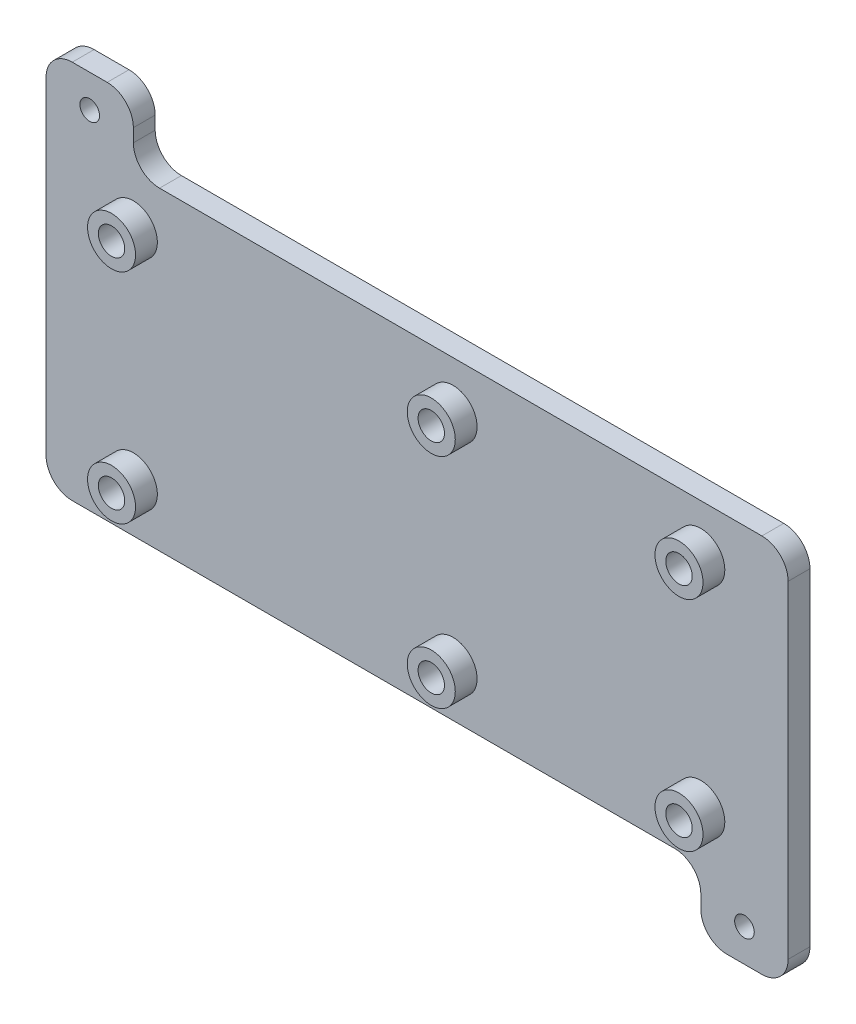
ISO-10303-21;
HEADER;
FILE_DESCRIPTION(('STEP AP214'),'2;1');
FILE_NAME('part.step','',(''),(''),'','','');
FILE_SCHEMA(('AUTOMOTIVE_DESIGN { 1 0 10303 214 1 1 1 1 }'));
ENDSEC;
DATA;
#1=APPLICATION_CONTEXT('core data for automotive mechanical design processes');
#2=APPLICATION_PROTOCOL_DEFINITION('international standard','automotive_design',2000,#1);
#3=PRODUCT_CONTEXT('',#1,'mechanical');
#4=PRODUCT('Part','Part','',(#3));
#5=PRODUCT_RELATED_PRODUCT_CATEGORY('part','',(#4));
#6=PRODUCT_DEFINITION_FORMATION('','',#4);
#7=PRODUCT_DEFINITION_CONTEXT('part definition',#1,'design');
#8=PRODUCT_DEFINITION('design','',#6,#7);
#9=PRODUCT_DEFINITION_SHAPE('','',#8);
#10=(LENGTH_UNIT() NAMED_UNIT(*) SI_UNIT(.MILLI.,.METRE.));
#11=(NAMED_UNIT(*) PLANE_ANGLE_UNIT() SI_UNIT($,.RADIAN.));
#12=(NAMED_UNIT(*) SI_UNIT($,.STERADIAN.) SOLID_ANGLE_UNIT());
#13=UNCERTAINTY_MEASURE_WITH_UNIT(LENGTH_MEASURE(1.E-05),#10,'distance_accuracy_value','');
#14=(GEOMETRIC_REPRESENTATION_CONTEXT(3) GLOBAL_UNCERTAINTY_ASSIGNED_CONTEXT((#13)) GLOBAL_UNIT_ASSIGNED_CONTEXT((#10,
#11,#12)) REPRESENTATION_CONTEXT('',''));
#15=CARTESIAN_POINT('',(0.,0.,0.));
#16=DIRECTION('',(0.,0.,1.));
#17=DIRECTION('',(1.,0.,0.));
#18=AXIS2_PLACEMENT_3D('',#15,#16,#17);
#19=CARTESIAN_POINT('',(85.,36.,5.));
#20=DIRECTION('',(-1.,0.,0.));
#21=DIRECTION('',(0.,-1.,0.));
#22=AXIS2_PLACEMENT_3D('',#19,#20,#21);
#23=PLANE('',#22);
#24=DIRECTION('',(0.,1.,0.));
#25=VECTOR('',#24,1.);
#26=CARTESIAN_POINT('',(85.,36.,5.));
#27=LINE('',#26,#25);
#28=CARTESIAN_POINT('',(85.,-45.,5.));
#29=VERTEX_POINT('',#28);
#30=CARTESIAN_POINT('',(85.,30.,5.));
#31=VERTEX_POINT('',#30);
#32=EDGE_CURVE('E191',#29,#31,#27,.T.);
#33=ORIENTED_EDGE('',*,*,#32,.F.);
#34=DIRECTION('',(0.,0.,1.));
#35=VECTOR('',#34,1.);
#36=CARTESIAN_POINT('',(85.,-45.,5.));
#37=LINE('',#36,#35);
#38=CARTESIAN_POINT('',(85.,-45.,0.));
#39=VERTEX_POINT('',#38);
#40=EDGE_CURVE('E275',#29,#39,#37,.F.);
#41=ORIENTED_EDGE('',*,*,#40,.T.);
#42=DIRECTION('',(0.,1.,0.));
#43=VECTOR('',#42,1.);
#44=CARTESIAN_POINT('',(85.,36.,0.));
#45=LINE('',#44,#43);
#46=CARTESIAN_POINT('',(85.,30.,0.));
#47=VERTEX_POINT('',#46);
#48=EDGE_CURVE('E332',#39,#47,#45,.T.);
#49=ORIENTED_EDGE('',*,*,#48,.T.);
#50=DIRECTION('',(0.,0.,-1.));
#51=VECTOR('',#50,1.);
#52=CARTESIAN_POINT('',(85.,30.,5.));
#53=LINE('',#52,#51);
#54=EDGE_CURVE('E272',#47,#31,#53,.F.);
#55=ORIENTED_EDGE('',*,*,#54,.T.);
#56=EDGE_LOOP('',(#33,#41,#49,#55));
#57=FACE_BOUND('',#56,.T.);
#58=ADVANCED_FACE('F45',(#57),#23,.F.);
#59=CARTESIAN_POINT('',(-85.,36.,5.));
#60=DIRECTION('',(0.,-1.,0.));
#61=DIRECTION('',(0.,0.,-1.));
#62=AXIS2_PLACEMENT_3D('',#59,#60,#61);
#63=PLANE('',#62);
#64=DIRECTION('',(-1.,0.,0.));
#65=VECTOR('',#64,1.);
#66=CARTESIAN_POINT('',(-85.,36.,5.));
#67=LINE('',#66,#65);
#68=CARTESIAN_POINT('',(79.,36.,5.));
#69=VERTEX_POINT('',#68);
#70=CARTESIAN_POINT('',(-59.,36.,5.));
#71=VERTEX_POINT('',#70);
#72=EDGE_CURVE('E197',#69,#71,#67,.T.);
#73=ORIENTED_EDGE('',*,*,#72,.F.);
#74=DIRECTION('',(0.,0.,-1.));
#75=VECTOR('',#74,1.);
#76=CARTESIAN_POINT('',(79.,36.,5.));
#77=LINE('',#76,#75);
#78=CARTESIAN_POINT('',(79.,36.,0.));
#79=VERTEX_POINT('',#78);
#80=EDGE_CURVE('E282',#69,#79,#77,.T.);
#81=ORIENTED_EDGE('',*,*,#80,.T.);
#82=DIRECTION('',(-1.,0.,0.));
#83=VECTOR('',#82,1.);
#84=CARTESIAN_POINT('',(-85.,36.,0.));
#85=LINE('',#84,#83);
#86=CARTESIAN_POINT('',(-59.,36.,0.));
#87=VERTEX_POINT('',#86);
#88=EDGE_CURVE('E199',#79,#87,#85,.T.);
#89=ORIENTED_EDGE('',*,*,#88,.T.);
#90=DIRECTION('',(0.,0.,1.));
#91=VECTOR('',#90,1.);
#92=CARTESIAN_POINT('',(-59.,36.,5.));
#93=LINE('',#92,#91);
#94=EDGE_CURVE('E278',#87,#71,#93,.T.);
#95=ORIENTED_EDGE('',*,*,#94,.T.);
#96=EDGE_LOOP('',(#73,#81,#89,#95));
#97=FACE_BOUND('',#96,.T.);
#98=ADVANCED_FACE('F330',(#97),#63,.F.);
#99=CARTESIAN_POINT('',(-85.,36.,5.));
#100=DIRECTION('',(1.,0.,0.));
#101=DIRECTION('',(0.,1.,0.));
#102=AXIS2_PLACEMENT_3D('',#99,#100,#101);
#103=PLANE('',#102);
#104=DIRECTION('',(0.,-1.,0.));
#105=VECTOR('',#104,1.);
#106=CARTESIAN_POINT('',(-85.,36.,5.));
#107=LINE('',#106,#105);
#108=CARTESIAN_POINT('',(-85.,45.,5.));
#109=VERTEX_POINT('',#108);
#110=CARTESIAN_POINT('',(-85.,-30.,5.));
#111=VERTEX_POINT('',#110);
#112=EDGE_CURVE('E340',#109,#111,#107,.T.);
#113=ORIENTED_EDGE('',*,*,#112,.F.);
#114=DIRECTION('',(0.,0.,1.));
#115=VECTOR('',#114,1.);
#116=CARTESIAN_POINT('',(-85.,45.,5.));
#117=LINE('',#116,#115);
#118=CARTESIAN_POINT('',(-85.,45.,0.));
#119=VERTEX_POINT('',#118);
#120=EDGE_CURVE('E301',#109,#119,#117,.F.);
#121=ORIENTED_EDGE('',*,*,#120,.T.);
#122=DIRECTION('',(0.,-1.,0.));
#123=VECTOR('',#122,1.);
#124=CARTESIAN_POINT('',(-85.,36.,0.));
#125=LINE('',#124,#123);
#126=CARTESIAN_POINT('',(-85.,-30.,0.));
#127=VERTEX_POINT('',#126);
#128=EDGE_CURVE('E192',#119,#127,#125,.T.);
#129=ORIENTED_EDGE('',*,*,#128,.T.);
#130=DIRECTION('',(0.,0.,-1.));
#131=VECTOR('',#130,1.);
#132=CARTESIAN_POINT('',(-85.,-30.,5.));
#133=LINE('',#132,#131);
#134=EDGE_CURVE('E164',#127,#111,#133,.F.);
#135=ORIENTED_EDGE('',*,*,#134,.T.);
#136=EDGE_LOOP('',(#113,#121,#129,#135));
#137=FACE_BOUND('',#136,.T.);
#138=ADVANCED_FACE('F499',(#137),#103,.F.);
#139=CARTESIAN_POINT('',(-85.,-36.,5.));
#140=DIRECTION('',(0.,1.,0.));
#141=DIRECTION('',(0.,0.,1.));
#142=AXIS2_PLACEMENT_3D('',#139,#140,#141);
#143=PLANE('',#142);
#144=DIRECTION('',(1.,0.,0.));
#145=VECTOR('',#144,1.);
#146=CARTESIAN_POINT('',(-85.,-36.,0.));
#147=LINE('',#146,#145);
#148=CARTESIAN_POINT('',(-79.,-36.,0.));
#149=VERTEX_POINT('',#148);
#150=CARTESIAN_POINT('',(59.,-36.,0.));
#151=VERTEX_POINT('',#150);
#152=EDGE_CURVE('E177',#149,#151,#147,.T.);
#153=ORIENTED_EDGE('',*,*,#152,.T.);
#154=DIRECTION('',(0.,0.,1.));
#155=VECTOR('',#154,1.);
#156=CARTESIAN_POINT('',(59.,-36.,5.));
#157=LINE('',#156,#155);
#158=CARTESIAN_POINT('',(59.,-36.,5.));
#159=VERTEX_POINT('',#158);
#160=EDGE_CURVE('E182',#151,#159,#157,.T.);
#161=ORIENTED_EDGE('',*,*,#160,.T.);
#162=DIRECTION('',(1.,0.,0.));
#163=VECTOR('',#162,1.);
#164=CARTESIAN_POINT('',(-85.,-36.,5.));
#165=LINE('',#164,#163);
#166=CARTESIAN_POINT('',(-79.,-36.,5.));
#167=VERTEX_POINT('',#166);
#168=EDGE_CURVE('E180',#167,#159,#165,.T.);
#169=ORIENTED_EDGE('',*,*,#168,.F.);
#170=DIRECTION('',(0.,0.,-1.));
#171=VECTOR('',#170,1.);
#172=CARTESIAN_POINT('',(-79.,-36.,5.));
#173=LINE('',#172,#171);
#174=EDGE_CURVE('E163',#167,#149,#173,.T.);
#175=ORIENTED_EDGE('',*,*,#174,.T.);
#176=EDGE_LOOP('',(#153,#161,#169,#175));
#177=FACE_BOUND('',#176,.T.);
#178=ADVANCED_FACE('F175',(#177),#143,.F.);
#179=CARTESIAN_POINT('',(0.,0.,5.));
#180=DIRECTION('',(0.,0.,1.));
#181=DIRECTION('',(1.,0.,0.));
#182=AXIS2_PLACEMENT_3D('',#179,#180,#181);
#183=PLANE('',#182);
#184=CARTESIAN_POINT('',(-75.,43.5,5.));
#185=DIRECTION('',(0.,0.,1.));
#186=DIRECTION('',(1.,0.,0.));
#187=AXIS2_PLACEMENT_3D('',#184,#185,#186);
#188=CIRCLE('',#187,2.24999999999999);
#189=CARTESIAN_POINT('',(-72.75,43.5,5.));
#190=VERTEX_POINT('',#189);
#191=EDGE_CURVE('E452',#190,#190,#188,.T.);
#192=ORIENTED_EDGE('',*,*,#191,.F.);
#193=EDGE_LOOP('',(#192));
#194=FACE_BOUND('',#193,.T.);
#195=CARTESIAN_POINT('',(75.,-43.5,5.));
#196=DIRECTION('',(0.,0.,1.));
#197=DIRECTION('',(1.,0.,0.));
#198=AXIS2_PLACEMENT_3D('',#195,#196,#197);
#199=CIRCLE('',#198,2.24999999999999);
#200=CARTESIAN_POINT('',(77.25,-43.5,5.));
#201=VERTEX_POINT('',#200);
#202=EDGE_CURVE('E444',#201,#201,#199,.T.);
#203=ORIENTED_EDGE('',*,*,#202,.F.);
#204=EDGE_LOOP('',(#203));
#205=FACE_BOUND('',#204,.T.);
#206=CARTESIAN_POINT('',(65.0000000000003,-25.,5.));
#207=DIRECTION('',(0.,0.,1.));
#208=DIRECTION('',(1.,0.,0.));
#209=AXIS2_PLACEMENT_3D('',#206,#207,#208);
#210=CIRCLE('',#209,5.49999999999954);
#211=CARTESIAN_POINT('',(70.4999999999999,-25.,5.));
#212=VERTEX_POINT('',#211);
#213=EDGE_CURVE('E406',#212,#212,#210,.T.);
#214=ORIENTED_EDGE('',*,*,#213,.F.);
#215=EDGE_LOOP('',(#214));
#216=FACE_BOUND('',#215,.T.);
#217=CARTESIAN_POINT('',(8.25000000000034,-25.,5.));
#218=DIRECTION('',(0.,0.,1.));
#219=DIRECTION('',(1.,0.,0.));
#220=AXIS2_PLACEMENT_3D('',#217,#218,#219);
#221=CIRCLE('',#220,5.49999999999953);
#222=CARTESIAN_POINT('',(13.7499999999999,-25.,5.));
#223=VERTEX_POINT('',#222);
#224=EDGE_CURVE('E394',#223,#223,#221,.T.);
#225=ORIENTED_EDGE('',*,*,#224,.F.);
#226=EDGE_LOOP('',(#225));
#227=FACE_BOUND('',#226,.T.);
#228=CARTESIAN_POINT('',(-64.9999999999997,-25.,5.));
#229=DIRECTION('',(0.,0.,1.));
#230=DIRECTION('',(1.,0.,0.));
#231=AXIS2_PLACEMENT_3D('',#228,#229,#230);
#232=CIRCLE('',#231,5.49999999999953);
#233=CARTESIAN_POINT('',(-59.5000000000002,-25.,5.));
#234=VERTEX_POINT('',#233);
#235=EDGE_CURVE('E382',#234,#234,#232,.T.);
#236=ORIENTED_EDGE('',*,*,#235,.F.);
#237=EDGE_LOOP('',(#236));
#238=FACE_BOUND('',#237,.T.);
#239=CARTESIAN_POINT('',(-64.9999999999997,25.,5.));
#240=DIRECTION('',(0.,0.,1.));
#241=DIRECTION('',(1.,0.,0.));
#242=AXIS2_PLACEMENT_3D('',#239,#240,#241);
#243=CIRCLE('',#242,5.49999999999952);
#244=CARTESIAN_POINT('',(-59.5000000000002,25.,5.));
#245=VERTEX_POINT('',#244);
#246=EDGE_CURVE('E370',#245,#245,#243,.T.);
#247=ORIENTED_EDGE('',*,*,#246,.F.);
#248=EDGE_LOOP('',(#247));
#249=FACE_BOUND('',#248,.T.);
#250=CARTESIAN_POINT('',(8.2500000000003,25.,5.));
#251=DIRECTION('',(0.,0.,1.));
#252=DIRECTION('',(1.,0.,0.));
#253=AXIS2_PLACEMENT_3D('',#250,#251,#252);
#254=CIRCLE('',#253,5.49999999999953);
#255=CARTESIAN_POINT('',(13.7499999999998,25.,5.));
#256=VERTEX_POINT('',#255);
#257=EDGE_CURVE('E358',#256,#256,#254,.T.);
#258=ORIENTED_EDGE('',*,*,#257,.F.);
#259=EDGE_LOOP('',(#258));
#260=FACE_BOUND('',#259,.T.);
#261=CARTESIAN_POINT('',(65.0000000000003,25.,5.));
#262=DIRECTION('',(0.,0.,1.));
#263=DIRECTION('',(1.,0.,0.));
#264=AXIS2_PLACEMENT_3D('',#261,#262,#263);
#265=CIRCLE('',#264,5.49999999999954);
#266=CARTESIAN_POINT('',(70.4999999999998,25.,5.));
#267=VERTEX_POINT('',#266);
#268=EDGE_CURVE('E346',#267,#267,#265,.T.);
#269=ORIENTED_EDGE('',*,*,#268,.F.);
#270=EDGE_LOOP('',(#269));
#271=FACE_BOUND('',#270,.T.);
#272=DIRECTION('',(0.,-1.,0.));
#273=VECTOR('',#272,1.);
#274=CARTESIAN_POINT('',(65.,0.,5.));
#275=LINE('',#274,#273);
#276=CARTESIAN_POINT('',(65.,-42.,5.));
#277=VERTEX_POINT('',#276);
#278=CARTESIAN_POINT('',(65.,-45.,5.));
#279=VERTEX_POINT('',#278);
#280=EDGE_CURVE('E432',#277,#279,#275,.T.);
#281=ORIENTED_EDGE('',*,*,#280,.T.);
#282=CARTESIAN_POINT('',(71.,-45.,5.));
#283=DIRECTION('',(0.,0.,1.));
#284=DIRECTION('',(1.,0.,0.));
#285=AXIS2_PLACEMENT_3D('',#282,#283,#284);
#286=CIRCLE('',#285,6.);
#287=CARTESIAN_POINT('',(71.,-51.,5.));
#288=VERTEX_POINT('',#287);
#289=EDGE_CURVE('E250',#279,#288,#286,.T.);
#290=ORIENTED_EDGE('',*,*,#289,.T.);
#291=DIRECTION('',(-1.,0.,0.));
#292=VECTOR('',#291,1.);
#293=CARTESIAN_POINT('',(0.,-51.,5.));
#294=LINE('',#293,#292);
#295=CARTESIAN_POINT('',(79.,-51.,5.));
#296=VERTEX_POINT('',#295);
#297=EDGE_CURVE('E427',#296,#288,#294,.T.);
#298=ORIENTED_EDGE('',*,*,#297,.F.);
#299=CARTESIAN_POINT('',(79.,-45.,5.));
#300=DIRECTION('',(0.,0.,1.));
#301=DIRECTION('',(1.,0.,0.));
#302=AXIS2_PLACEMENT_3D('',#299,#300,#301);
#303=CIRCLE('',#302,6.);
#304=EDGE_CURVE('E247',#296,#29,#303,.T.);
#305=ORIENTED_EDGE('',*,*,#304,.T.);
#306=ORIENTED_EDGE('',*,*,#32,.T.);
#307=CARTESIAN_POINT('',(79.,30.,5.));
#308=DIRECTION('',(0.,0.,1.));
#309=DIRECTION('',(1.,0.,0.));
#310=AXIS2_PLACEMENT_3D('',#307,#308,#309);
#311=CIRCLE('',#310,6.);
#312=EDGE_CURVE('E244',#31,#69,#311,.T.);
#313=ORIENTED_EDGE('',*,*,#312,.T.);
#314=ORIENTED_EDGE('',*,*,#72,.T.);
#315=CARTESIAN_POINT('',(-59.,42.,5.));
#316=DIRECTION('',(0.,0.,1.));
#317=DIRECTION('',(1.,0.,0.));
#318=AXIS2_PLACEMENT_3D('',#315,#316,#317);
#319=CIRCLE('',#318,6.);
#320=CARTESIAN_POINT('',(-65.,42.,5.));
#321=VERTEX_POINT('',#320);
#322=EDGE_CURVE('E54',#71,#321,#319,.F.);
#323=ORIENTED_EDGE('',*,*,#322,.T.);
#324=DIRECTION('',(0.,1.,0.));
#325=VECTOR('',#324,1.);
#326=CARTESIAN_POINT('',(-65.,0.,5.));
#327=LINE('',#326,#325);
#328=CARTESIAN_POINT('',(-65.,45.,5.));
#329=VERTEX_POINT('',#328);
#330=EDGE_CURVE('E315',#321,#329,#327,.T.);
#331=ORIENTED_EDGE('',*,*,#330,.T.);
#332=CARTESIAN_POINT('',(-71.,45.,5.));
#333=DIRECTION('',(0.,0.,1.));
#334=DIRECTION('',(1.,0.,0.));
#335=AXIS2_PLACEMENT_3D('',#332,#333,#334);
#336=CIRCLE('',#335,6.);
#337=CARTESIAN_POINT('',(-71.,51.,5.));
#338=VERTEX_POINT('',#337);
#339=EDGE_CURVE('E241',#329,#338,#336,.T.);
#340=ORIENTED_EDGE('',*,*,#339,.T.);
#341=DIRECTION('',(1.,0.,0.));
#342=VECTOR('',#341,1.);
#343=CARTESIAN_POINT('',(0.,51.,5.));
#344=LINE('',#343,#342);
#345=CARTESIAN_POINT('',(-79.,51.,5.));
#346=VERTEX_POINT('',#345);
#347=EDGE_CURVE('E325',#346,#338,#344,.T.);
#348=ORIENTED_EDGE('',*,*,#347,.F.);
#349=CARTESIAN_POINT('',(-79.,45.,5.));
#350=DIRECTION('',(0.,0.,1.));
#351=DIRECTION('',(1.,0.,0.));
#352=AXIS2_PLACEMENT_3D('',#349,#350,#351);
#353=CIRCLE('',#352,6.);
#354=EDGE_CURVE('E238',#346,#109,#353,.T.);
#355=ORIENTED_EDGE('',*,*,#354,.T.);
#356=ORIENTED_EDGE('',*,*,#112,.T.);
#357=CARTESIAN_POINT('',(-79.,-30.,5.));
#358=DIRECTION('',(0.,0.,1.));
#359=DIRECTION('',(1.,0.,0.));
#360=AXIS2_PLACEMENT_3D('',#357,#358,#359);
#361=CIRCLE('',#360,6.);
#362=EDGE_CURVE('E235',#111,#167,#361,.T.);
#363=ORIENTED_EDGE('',*,*,#362,.T.);
#364=ORIENTED_EDGE('',*,*,#168,.T.);
#365=CARTESIAN_POINT('',(59.,-42.,5.));
#366=DIRECTION('',(0.,0.,1.));
#367=DIRECTION('',(1.,0.,0.));
#368=AXIS2_PLACEMENT_3D('',#365,#366,#367);
#369=CIRCLE('',#368,6.);
#370=EDGE_CURVE('E304',#159,#277,#369,.F.);
#371=ORIENTED_EDGE('',*,*,#370,.T.);
#372=EDGE_LOOP('',(#281,#290,#298,#305,#306,#313,#314,#323,#331,#340,#348,#355,#356,#363,#364,#371));
#373=FACE_BOUND('',#372,.T.);
#374=ADVANCED_FACE('F314',(#194,#205,#216,#227,#238,#249,#260,#271,#373),#183,.T.);
#375=CARTESIAN_POINT('',(0.,0.,0.));
#376=DIRECTION('',(0.,0.,1.));
#377=DIRECTION('',(1.,0.,0.));
#378=AXIS2_PLACEMENT_3D('',#375,#376,#377);
#379=PLANE('',#378);
#380=CARTESIAN_POINT('',(-75.,43.5,0.));
#381=DIRECTION('',(0.,0.,1.));
#382=DIRECTION('',(1.,0.,0.));
#383=AXIS2_PLACEMENT_3D('',#380,#381,#382);
#384=CIRCLE('',#383,2.24999999999999);
#385=CARTESIAN_POINT('',(-72.75,43.5,0.));
#386=VERTEX_POINT('',#385);
#387=EDGE_CURVE('E448',#386,#386,#384,.T.);
#388=ORIENTED_EDGE('',*,*,#387,.T.);
#389=EDGE_LOOP('',(#388));
#390=FACE_BOUND('',#389,.T.);
#391=CARTESIAN_POINT('',(75.,-43.5,0.));
#392=DIRECTION('',(0.,0.,1.));
#393=DIRECTION('',(1.,0.,0.));
#394=AXIS2_PLACEMENT_3D('',#391,#392,#393);
#395=CIRCLE('',#394,2.24999999999999);
#396=CARTESIAN_POINT('',(77.25,-43.5,0.));
#397=VERTEX_POINT('',#396);
#398=EDGE_CURVE('E435',#397,#397,#395,.T.);
#399=ORIENTED_EDGE('',*,*,#398,.T.);
#400=EDGE_LOOP('',(#399));
#401=FACE_BOUND('',#400,.T.);
#402=DIRECTION('',(-1.,0.,0.));
#403=VECTOR('',#402,1.);
#404=CARTESIAN_POINT('',(0.,-51.,0.));
#405=LINE('',#404,#403);
#406=CARTESIAN_POINT('',(79.,-51.,0.));
#407=VERTEX_POINT('',#406);
#408=CARTESIAN_POINT('',(71.,-51.,0.));
#409=VERTEX_POINT('',#408);
#410=EDGE_CURVE('E326',#407,#409,#405,.T.);
#411=ORIENTED_EDGE('',*,*,#410,.T.);
#412=CARTESIAN_POINT('',(71.,-45.,0.));
#413=DIRECTION('',(0.,0.,1.));
#414=DIRECTION('',(1.,0.,0.));
#415=AXIS2_PLACEMENT_3D('',#412,#413,#414);
#416=CIRCLE('',#415,6.);
#417=CARTESIAN_POINT('',(65.,-45.,0.));
#418=VERTEX_POINT('',#417);
#419=EDGE_CURVE('E269',#409,#418,#416,.F.);
#420=ORIENTED_EDGE('',*,*,#419,.T.);
#421=DIRECTION('',(0.,-1.,0.));
#422=VECTOR('',#421,1.);
#423=CARTESIAN_POINT('',(65.,0.,0.));
#424=LINE('',#423,#422);
#425=CARTESIAN_POINT('',(65.,-42.,0.));
#426=VERTEX_POINT('',#425);
#427=EDGE_CURVE('E431',#426,#418,#424,.T.);
#428=ORIENTED_EDGE('',*,*,#427,.F.);
#429=CARTESIAN_POINT('',(59.,-42.,0.));
#430=DIRECTION('',(0.,0.,1.));
#431=DIRECTION('',(1.,0.,0.));
#432=AXIS2_PLACEMENT_3D('',#429,#430,#431);
#433=CIRCLE('',#432,6.);
#434=EDGE_CURVE('E189',#426,#151,#433,.T.);
#435=ORIENTED_EDGE('',*,*,#434,.T.);
#436=ORIENTED_EDGE('',*,*,#152,.F.);
#437=CARTESIAN_POINT('',(-79.,-30.,0.));
#438=DIRECTION('',(0.,0.,1.));
#439=DIRECTION('',(1.,0.,0.));
#440=AXIS2_PLACEMENT_3D('',#437,#438,#439);
#441=CIRCLE('',#440,6.);
#442=EDGE_CURVE('E160',#149,#127,#441,.F.);
#443=ORIENTED_EDGE('',*,*,#442,.T.);
#444=ORIENTED_EDGE('',*,*,#128,.F.);
#445=CARTESIAN_POINT('',(-79.,45.,0.));
#446=DIRECTION('',(0.,0.,1.));
#447=DIRECTION('',(1.,0.,0.));
#448=AXIS2_PLACEMENT_3D('',#445,#446,#447);
#449=CIRCLE('',#448,6.);
#450=CARTESIAN_POINT('',(-79.,51.,0.));
#451=VERTEX_POINT('',#450);
#452=EDGE_CURVE('E169',#119,#451,#449,.F.);
#453=ORIENTED_EDGE('',*,*,#452,.T.);
#454=DIRECTION('',(1.,0.,0.));
#455=VECTOR('',#454,1.);
#456=CARTESIAN_POINT('',(0.,51.,0.));
#457=LINE('',#456,#455);
#458=CARTESIAN_POINT('',(-71.,51.,0.));
#459=VERTEX_POINT('',#458);
#460=EDGE_CURVE('E417',#451,#459,#457,.T.);
#461=ORIENTED_EDGE('',*,*,#460,.T.);
#462=CARTESIAN_POINT('',(-71.,45.,0.));
#463=DIRECTION('',(0.,0.,1.));
#464=DIRECTION('',(1.,0.,0.));
#465=AXIS2_PLACEMENT_3D('',#462,#463,#464);
#466=CIRCLE('',#465,6.);
#467=CARTESIAN_POINT('',(-65.,45.,0.));
#468=VERTEX_POINT('',#467);
#469=EDGE_CURVE('E261',#459,#468,#466,.F.);
#470=ORIENTED_EDGE('',*,*,#469,.T.);
#471=DIRECTION('',(0.,1.,0.));
#472=VECTOR('',#471,1.);
#473=CARTESIAN_POINT('',(-65.,0.,0.));
#474=LINE('',#473,#472);
#475=CARTESIAN_POINT('',(-65.,42.,0.));
#476=VERTEX_POINT('',#475);
#477=EDGE_CURVE('E420',#476,#468,#474,.T.);
#478=ORIENTED_EDGE('',*,*,#477,.F.);
#479=CARTESIAN_POINT('',(-59.,42.,0.));
#480=DIRECTION('',(0.,0.,1.));
#481=DIRECTION('',(1.,0.,0.));
#482=AXIS2_PLACEMENT_3D('',#479,#480,#481);
#483=CIRCLE('',#482,6.);
#484=EDGE_CURVE('E11',#476,#87,#483,.T.);
#485=ORIENTED_EDGE('',*,*,#484,.T.);
#486=ORIENTED_EDGE('',*,*,#88,.F.);
#487=CARTESIAN_POINT('',(79.,30.,0.));
#488=DIRECTION('',(0.,0.,1.));
#489=DIRECTION('',(1.,0.,0.));
#490=AXIS2_PLACEMENT_3D('',#487,#488,#489);
#491=CIRCLE('',#490,6.);
#492=EDGE_CURVE('E67',#79,#47,#491,.F.);
#493=ORIENTED_EDGE('',*,*,#492,.T.);
#494=ORIENTED_EDGE('',*,*,#48,.F.);
#495=CARTESIAN_POINT('',(79.,-45.,0.));
#496=DIRECTION('',(0.,0.,1.));
#497=DIRECTION('',(1.,0.,0.));
#498=AXIS2_PLACEMENT_3D('',#495,#496,#497);
#499=CIRCLE('',#498,6.);
#500=EDGE_CURVE('E266',#39,#407,#499,.F.);
#501=ORIENTED_EDGE('',*,*,#500,.T.);
#502=EDGE_LOOP('',(#411,#420,#428,#435,#436,#443,#444,#453,#461,#470,#478,#485,#486,#493,#494,#501));
#503=FACE_BOUND('',#502,.T.);
#504=ADVANCED_FACE('F186',(#390,#401,#503),#379,.F.);
#505=CARTESIAN_POINT('',(65.0000000000003,25.,10.));
#506=DIRECTION('',(0.,0.,1.));
#507=DIRECTION('',(1.,0.,0.));
#508=AXIS2_PLACEMENT_3D('',#505,#506,#507);
#509=PLANE('',#508);
#510=CARTESIAN_POINT('',(65.0000000000003,25.,10.));
#511=DIRECTION('',(0.,0.,1.));
#512=DIRECTION('',(1.,0.,0.));
#513=AXIS2_PLACEMENT_3D('',#510,#511,#512);
#514=CIRCLE('',#513,5.49999999999954);
#515=CARTESIAN_POINT('',(70.4999999999998,25.,10.));
#516=VERTEX_POINT('',#515);
#517=EDGE_CURVE('E335',#516,#516,#514,.T.);
#518=ORIENTED_EDGE('',*,*,#517,.T.);
#519=EDGE_LOOP('',(#518));
#520=FACE_BOUND('',#519,.T.);
#521=CARTESIAN_POINT('',(65.0000000000003,25.,10.));
#522=DIRECTION('',(0.,0.,1.));
#523=DIRECTION('',(1.,0.,0.));
#524=AXIS2_PLACEMENT_3D('',#521,#522,#523);
#525=CIRCLE('',#524,3.02499999999954);
#526=CARTESIAN_POINT('',(68.0249999999998,25.,10.));
#527=VERTEX_POINT('',#526);
#528=EDGE_CURVE('E350',#527,#527,#525,.T.);
#529=ORIENTED_EDGE('',*,*,#528,.F.);
#530=EDGE_LOOP('',(#529));
#531=FACE_BOUND('',#530,.T.);
#532=ADVANCED_FACE('F481',(#520,#531),#509,.T.);
#533=CARTESIAN_POINT('',(65.0000000000003,25.,10.));
#534=DIRECTION('',(0.,0.,-1.));
#535=DIRECTION('',(-1.,0.,0.));
#536=AXIS2_PLACEMENT_3D('',#533,#534,#535);
#537=CYLINDRICAL_SURFACE('',#536,5.49999999999954);
#538=ORIENTED_EDGE('',*,*,#517,.F.);
#539=EDGE_LOOP('',(#538));
#540=FACE_BOUND('',#539,.T.);
#541=ORIENTED_EDGE('',*,*,#268,.T.);
#542=EDGE_LOOP('',(#541));
#543=FACE_BOUND('',#542,.T.);
#544=ADVANCED_FACE('F478',(#540,#543),#537,.T.);
#545=CARTESIAN_POINT('',(65.0000000000003,25.,10.));
#546=DIRECTION('',(0.,0.,-1.));
#547=DIRECTION('',(-1.,0.,0.));
#548=AXIS2_PLACEMENT_3D('',#545,#546,#547);
#549=CYLINDRICAL_SURFACE('',#548,3.02499999999954);
#550=ORIENTED_EDGE('',*,*,#528,.T.);
#551=EDGE_LOOP('',(#550));
#552=FACE_BOUND('',#551,.T.);
#553=CARTESIAN_POINT('',(65.0000000000003,25.,5.));
#554=DIRECTION('',(0.,0.,1.));
#555=DIRECTION('',(1.,0.,0.));
#556=AXIS2_PLACEMENT_3D('',#553,#554,#555);
#557=CIRCLE('',#556,3.02499999999954);
#558=CARTESIAN_POINT('',(68.0249999999998,25.,5.));
#559=VERTEX_POINT('',#558);
#560=EDGE_CURVE('E203',#559,#559,#557,.F.);
#561=ORIENTED_EDGE('',*,*,#560,.T.);
#562=EDGE_LOOP('',(#561));
#563=FACE_BOUND('',#562,.T.);
#564=ADVANCED_FACE('F480',(#552,#563),#549,.F.);
#565=ORIENTED_EDGE('',*,*,#560,.F.);
#566=EDGE_LOOP('',(#565));
#567=FACE_BOUND('',#566,.T.);
#568=ADVANCED_FACE('F463',(#567),#183,.T.);
#569=CARTESIAN_POINT('',(8.2500000000003,25.,10.));
#570=DIRECTION('',(0.,0.,1.));
#571=DIRECTION('',(1.,0.,0.));
#572=AXIS2_PLACEMENT_3D('',#569,#570,#571);
#573=PLANE('',#572);
#574=CARTESIAN_POINT('',(8.2500000000003,25.,10.));
#575=DIRECTION('',(0.,0.,1.));
#576=DIRECTION('',(1.,0.,0.));
#577=AXIS2_PLACEMENT_3D('',#574,#575,#576);
#578=CIRCLE('',#577,5.49999999999953);
#579=CARTESIAN_POINT('',(13.7499999999998,25.,10.));
#580=VERTEX_POINT('',#579);
#581=EDGE_CURVE('E357',#580,#580,#578,.T.);
#582=ORIENTED_EDGE('',*,*,#581,.T.);
#583=EDGE_LOOP('',(#582));
#584=FACE_BOUND('',#583,.T.);
#585=CARTESIAN_POINT('',(8.2500000000003,25.,10.));
#586=DIRECTION('',(0.,0.,1.));
#587=DIRECTION('',(1.,0.,0.));
#588=AXIS2_PLACEMENT_3D('',#585,#586,#587);
#589=CIRCLE('',#588,3.02499999999953);
#590=CARTESIAN_POINT('',(11.2749999999998,25.,10.));
#591=VERTEX_POINT('',#590);
#592=EDGE_CURVE('E362',#591,#591,#589,.T.);
#593=ORIENTED_EDGE('',*,*,#592,.F.);
#594=EDGE_LOOP('',(#593));
#595=FACE_BOUND('',#594,.T.);
#596=ADVANCED_FACE('F634',(#584,#595),#573,.T.);
#597=CARTESIAN_POINT('',(8.2500000000003,25.,10.));
#598=DIRECTION('',(0.,0.,-1.));
#599=DIRECTION('',(-1.,0.,0.));
#600=AXIS2_PLACEMENT_3D('',#597,#598,#599);
#601=CYLINDRICAL_SURFACE('',#600,5.49999999999953);
#602=ORIENTED_EDGE('',*,*,#581,.F.);
#603=EDGE_LOOP('',(#602));
#604=FACE_BOUND('',#603,.T.);
#605=ORIENTED_EDGE('',*,*,#257,.T.);
#606=EDGE_LOOP('',(#605));
#607=FACE_BOUND('',#606,.T.);
#608=ADVANCED_FACE('F632',(#604,#607),#601,.T.);
#609=CARTESIAN_POINT('',(8.2500000000003,25.,10.));
#610=DIRECTION('',(0.,0.,-1.));
#611=DIRECTION('',(-1.,0.,0.));
#612=AXIS2_PLACEMENT_3D('',#609,#610,#611);
#613=CYLINDRICAL_SURFACE('',#612,3.02499999999953);
#614=ORIENTED_EDGE('',*,*,#592,.T.);
#615=EDGE_LOOP('',(#614));
#616=FACE_BOUND('',#615,.T.);
#617=CARTESIAN_POINT('',(8.2500000000003,25.,5.));
#618=DIRECTION('',(0.,0.,1.));
#619=DIRECTION('',(1.,0.,0.));
#620=AXIS2_PLACEMENT_3D('',#617,#618,#619);
#621=CIRCLE('',#620,3.02499999999953);
#622=CARTESIAN_POINT('',(11.2749999999998,25.,5.));
#623=VERTEX_POINT('',#622);
#624=EDGE_CURVE('E207',#623,#623,#621,.F.);
#625=ORIENTED_EDGE('',*,*,#624,.T.);
#626=EDGE_LOOP('',(#625));
#627=FACE_BOUND('',#626,.T.);
#628=ADVANCED_FACE('F629',(#616,#627),#613,.F.);
#629=ORIENTED_EDGE('',*,*,#624,.F.);
#630=EDGE_LOOP('',(#629));
#631=FACE_BOUND('',#630,.T.);
#632=ADVANCED_FACE('F624',(#631),#183,.T.);
#633=CARTESIAN_POINT('',(-64.9999999999997,25.,10.));
#634=DIRECTION('',(0.,0.,1.));
#635=DIRECTION('',(1.,0.,0.));
#636=AXIS2_PLACEMENT_3D('',#633,#634,#635);
#637=PLANE('',#636);
#638=CARTESIAN_POINT('',(-64.9999999999997,25.,10.));
#639=DIRECTION('',(0.,0.,1.));
#640=DIRECTION('',(1.,0.,0.));
#641=AXIS2_PLACEMENT_3D('',#638,#639,#640);
#642=CIRCLE('',#641,5.49999999999952);
#643=CARTESIAN_POINT('',(-59.5000000000002,25.,10.));
#644=VERTEX_POINT('',#643);
#645=EDGE_CURVE('E369',#644,#644,#642,.T.);
#646=ORIENTED_EDGE('',*,*,#645,.T.);
#647=EDGE_LOOP('',(#646));
#648=FACE_BOUND('',#647,.T.);
#649=CARTESIAN_POINT('',(-64.9999999999997,25.,10.));
#650=DIRECTION('',(0.,0.,1.));
#651=DIRECTION('',(1.,0.,0.));
#652=AXIS2_PLACEMENT_3D('',#649,#650,#651);
#653=CIRCLE('',#652,3.02499999999953);
#654=CARTESIAN_POINT('',(-61.9750000000002,25.,10.));
#655=VERTEX_POINT('',#654);
#656=EDGE_CURVE('E374',#655,#655,#653,.T.);
#657=ORIENTED_EDGE('',*,*,#656,.F.);
#658=EDGE_LOOP('',(#657));
#659=FACE_BOUND('',#658,.T.);
#660=ADVANCED_FACE('F621',(#648,#659),#637,.T.);
#661=CARTESIAN_POINT('',(-64.9999999999997,25.,10.));
#662=DIRECTION('',(0.,0.,-1.));
#663=DIRECTION('',(-1.,0.,0.));
#664=AXIS2_PLACEMENT_3D('',#661,#662,#663);
#665=CYLINDRICAL_SURFACE('',#664,5.49999999999952);
#666=ORIENTED_EDGE('',*,*,#645,.F.);
#667=EDGE_LOOP('',(#666));
#668=FACE_BOUND('',#667,.T.);
#669=ORIENTED_EDGE('',*,*,#246,.T.);
#670=EDGE_LOOP('',(#669));
#671=FACE_BOUND('',#670,.T.);
#672=ADVANCED_FACE('F619',(#668,#671),#665,.T.);
#673=CARTESIAN_POINT('',(-64.9999999999997,25.,10.));
#674=DIRECTION('',(0.,0.,-1.));
#675=DIRECTION('',(-1.,0.,0.));
#676=AXIS2_PLACEMENT_3D('',#673,#674,#675);
#677=CYLINDRICAL_SURFACE('',#676,3.02499999999953);
#678=ORIENTED_EDGE('',*,*,#656,.T.);
#679=EDGE_LOOP('',(#678));
#680=FACE_BOUND('',#679,.T.);
#681=CARTESIAN_POINT('',(-64.9999999999997,25.,5.));
#682=DIRECTION('',(0.,0.,1.));
#683=DIRECTION('',(1.,0.,0.));
#684=AXIS2_PLACEMENT_3D('',#681,#682,#683);
#685=CIRCLE('',#684,3.02499999999953);
#686=CARTESIAN_POINT('',(-61.9750000000002,25.,5.));
#687=VERTEX_POINT('',#686);
#688=EDGE_CURVE('E211',#687,#687,#685,.F.);
#689=ORIENTED_EDGE('',*,*,#688,.T.);
#690=EDGE_LOOP('',(#689));
#691=FACE_BOUND('',#690,.T.);
#692=ADVANCED_FACE('F616',(#680,#691),#677,.F.);
#693=ORIENTED_EDGE('',*,*,#688,.F.);
#694=EDGE_LOOP('',(#693));
#695=FACE_BOUND('',#694,.T.);
#696=ADVANCED_FACE('F611',(#695),#183,.T.);
#697=CARTESIAN_POINT('',(-64.9999999999997,-25.,10.));
#698=DIRECTION('',(0.,0.,1.));
#699=DIRECTION('',(1.,0.,0.));
#700=AXIS2_PLACEMENT_3D('',#697,#698,#699);
#701=PLANE('',#700);
#702=CARTESIAN_POINT('',(-64.9999999999997,-25.,10.));
#703=DIRECTION('',(0.,0.,1.));
#704=DIRECTION('',(1.,0.,0.));
#705=AXIS2_PLACEMENT_3D('',#702,#703,#704);
#706=CIRCLE('',#705,5.49999999999953);
#707=CARTESIAN_POINT('',(-59.5000000000002,-25.,10.));
#708=VERTEX_POINT('',#707);
#709=EDGE_CURVE('E381',#708,#708,#706,.T.);
#710=ORIENTED_EDGE('',*,*,#709,.T.);
#711=EDGE_LOOP('',(#710));
#712=FACE_BOUND('',#711,.T.);
#713=CARTESIAN_POINT('',(-64.9999999999997,-25.,10.));
#714=DIRECTION('',(0.,0.,1.));
#715=DIRECTION('',(1.,0.,0.));
#716=AXIS2_PLACEMENT_3D('',#713,#714,#715);
#717=CIRCLE('',#716,3.02499999999954);
#718=CARTESIAN_POINT('',(-61.9750000000002,-25.,10.));
#719=VERTEX_POINT('',#718);
#720=EDGE_CURVE('E386',#719,#719,#717,.T.);
#721=ORIENTED_EDGE('',*,*,#720,.F.);
#722=EDGE_LOOP('',(#721));
#723=FACE_BOUND('',#722,.T.);
#724=ADVANCED_FACE('F608',(#712,#723),#701,.T.);
#725=CARTESIAN_POINT('',(-64.9999999999997,-25.,10.));
#726=DIRECTION('',(0.,0.,-1.));
#727=DIRECTION('',(-1.,0.,0.));
#728=AXIS2_PLACEMENT_3D('',#725,#726,#727);
#729=CYLINDRICAL_SURFACE('',#728,5.49999999999953);
#730=ORIENTED_EDGE('',*,*,#709,.F.);
#731=EDGE_LOOP('',(#730));
#732=FACE_BOUND('',#731,.T.);
#733=ORIENTED_EDGE('',*,*,#235,.T.);
#734=EDGE_LOOP('',(#733));
#735=FACE_BOUND('',#734,.T.);
#736=ADVANCED_FACE('F606',(#732,#735),#729,.T.);
#737=CARTESIAN_POINT('',(-64.9999999999997,-25.,10.));
#738=DIRECTION('',(0.,0.,-1.));
#739=DIRECTION('',(-1.,0.,0.));
#740=AXIS2_PLACEMENT_3D('',#737,#738,#739);
#741=CYLINDRICAL_SURFACE('',#740,3.02499999999954);
#742=ORIENTED_EDGE('',*,*,#720,.T.);
#743=EDGE_LOOP('',(#742));
#744=FACE_BOUND('',#743,.T.);
#745=CARTESIAN_POINT('',(-64.9999999999997,-25.,5.));
#746=DIRECTION('',(0.,0.,1.));
#747=DIRECTION('',(1.,0.,0.));
#748=AXIS2_PLACEMENT_3D('',#745,#746,#747);
#749=CIRCLE('',#748,3.02499999999954);
#750=CARTESIAN_POINT('',(-61.9750000000002,-25.,5.));
#751=VERTEX_POINT('',#750);
#752=EDGE_CURVE('E215',#751,#751,#749,.F.);
#753=ORIENTED_EDGE('',*,*,#752,.T.);
#754=EDGE_LOOP('',(#753));
#755=FACE_BOUND('',#754,.T.);
#756=ADVANCED_FACE('F603',(#744,#755),#741,.F.);
#757=ORIENTED_EDGE('',*,*,#752,.F.);
#758=EDGE_LOOP('',(#757));
#759=FACE_BOUND('',#758,.T.);
#760=ADVANCED_FACE('F598',(#759),#183,.T.);
#761=CARTESIAN_POINT('',(8.25000000000034,-25.,10.));
#762=DIRECTION('',(0.,0.,1.));
#763=DIRECTION('',(1.,0.,0.));
#764=AXIS2_PLACEMENT_3D('',#761,#762,#763);
#765=PLANE('',#764);
#766=CARTESIAN_POINT('',(8.25000000000034,-25.,10.));
#767=DIRECTION('',(0.,0.,1.));
#768=DIRECTION('',(1.,0.,0.));
#769=AXIS2_PLACEMENT_3D('',#766,#767,#768);
#770=CIRCLE('',#769,5.49999999999953);
#771=CARTESIAN_POINT('',(13.7499999999999,-25.,10.));
#772=VERTEX_POINT('',#771);
#773=EDGE_CURVE('E393',#772,#772,#770,.T.);
#774=ORIENTED_EDGE('',*,*,#773,.T.);
#775=EDGE_LOOP('',(#774));
#776=FACE_BOUND('',#775,.T.);
#777=CARTESIAN_POINT('',(8.25000000000034,-25.,10.));
#778=DIRECTION('',(0.,0.,1.));
#779=DIRECTION('',(1.,0.,0.));
#780=AXIS2_PLACEMENT_3D('',#777,#778,#779);
#781=CIRCLE('',#780,3.02499999999953);
#782=CARTESIAN_POINT('',(11.2749999999999,-25.,10.));
#783=VERTEX_POINT('',#782);
#784=EDGE_CURVE('E398',#783,#783,#781,.T.);
#785=ORIENTED_EDGE('',*,*,#784,.F.);
#786=EDGE_LOOP('',(#785));
#787=FACE_BOUND('',#786,.T.);
#788=ADVANCED_FACE('F595',(#776,#787),#765,.T.);
#789=CARTESIAN_POINT('',(8.25000000000034,-25.,10.));
#790=DIRECTION('',(0.,0.,-1.));
#791=DIRECTION('',(-1.,0.,0.));
#792=AXIS2_PLACEMENT_3D('',#789,#790,#791);
#793=CYLINDRICAL_SURFACE('',#792,5.49999999999953);
#794=ORIENTED_EDGE('',*,*,#773,.F.);
#795=EDGE_LOOP('',(#794));
#796=FACE_BOUND('',#795,.T.);
#797=ORIENTED_EDGE('',*,*,#224,.T.);
#798=EDGE_LOOP('',(#797));
#799=FACE_BOUND('',#798,.T.);
#800=ADVANCED_FACE('F593',(#796,#799),#793,.T.);
#801=CARTESIAN_POINT('',(8.25000000000034,-25.,10.));
#802=DIRECTION('',(0.,0.,-1.));
#803=DIRECTION('',(-1.,0.,0.));
#804=AXIS2_PLACEMENT_3D('',#801,#802,#803);
#805=CYLINDRICAL_SURFACE('',#804,3.02499999999953);
#806=ORIENTED_EDGE('',*,*,#784,.T.);
#807=EDGE_LOOP('',(#806));
#808=FACE_BOUND('',#807,.T.);
#809=CARTESIAN_POINT('',(8.25000000000034,-25.,5.));
#810=DIRECTION('',(0.,0.,1.));
#811=DIRECTION('',(1.,0.,0.));
#812=AXIS2_PLACEMENT_3D('',#809,#810,#811);
#813=CIRCLE('',#812,3.02499999999953);
#814=CARTESIAN_POINT('',(11.2749999999999,-25.,5.));
#815=VERTEX_POINT('',#814);
#816=EDGE_CURVE('E219',#815,#815,#813,.F.);
#817=ORIENTED_EDGE('',*,*,#816,.T.);
#818=EDGE_LOOP('',(#817));
#819=FACE_BOUND('',#818,.T.);
#820=ADVANCED_FACE('F590',(#808,#819),#805,.F.);
#821=ORIENTED_EDGE('',*,*,#816,.F.);
#822=EDGE_LOOP('',(#821));
#823=FACE_BOUND('',#822,.T.);
#824=ADVANCED_FACE('F585',(#823),#183,.T.);
#825=CARTESIAN_POINT('',(65.0000000000003,-25.,10.));
#826=DIRECTION('',(0.,0.,1.));
#827=DIRECTION('',(1.,0.,0.));
#828=AXIS2_PLACEMENT_3D('',#825,#826,#827);
#829=PLANE('',#828);
#830=CARTESIAN_POINT('',(65.0000000000003,-25.,10.));
#831=DIRECTION('',(0.,0.,1.));
#832=DIRECTION('',(1.,0.,0.));
#833=AXIS2_PLACEMENT_3D('',#830,#831,#832);
#834=CIRCLE('',#833,5.49999999999954);
#835=CARTESIAN_POINT('',(70.4999999999999,-25.,10.));
#836=VERTEX_POINT('',#835);
#837=EDGE_CURVE('E405',#836,#836,#834,.T.);
#838=ORIENTED_EDGE('',*,*,#837,.T.);
#839=EDGE_LOOP('',(#838));
#840=FACE_BOUND('',#839,.T.);
#841=CARTESIAN_POINT('',(65.0000000000003,-25.,10.));
#842=DIRECTION('',(0.,0.,1.));
#843=DIRECTION('',(1.,0.,0.));
#844=AXIS2_PLACEMENT_3D('',#841,#842,#843);
#845=CIRCLE('',#844,3.02499999999954);
#846=CARTESIAN_POINT('',(68.0249999999998,-25.,10.));
#847=VERTEX_POINT('',#846);
#848=EDGE_CURVE('E410',#847,#847,#845,.T.);
#849=ORIENTED_EDGE('',*,*,#848,.F.);
#850=EDGE_LOOP('',(#849));
#851=FACE_BOUND('',#850,.T.);
#852=ADVANCED_FACE('F582',(#840,#851),#829,.T.);
#853=CARTESIAN_POINT('',(65.0000000000003,-25.,10.));
#854=DIRECTION('',(0.,0.,-1.));
#855=DIRECTION('',(-1.,0.,0.));
#856=AXIS2_PLACEMENT_3D('',#853,#854,#855);
#857=CYLINDRICAL_SURFACE('',#856,5.49999999999954);
#858=ORIENTED_EDGE('',*,*,#837,.F.);
#859=EDGE_LOOP('',(#858));
#860=FACE_BOUND('',#859,.T.);
#861=ORIENTED_EDGE('',*,*,#213,.T.);
#862=EDGE_LOOP('',(#861));
#863=FACE_BOUND('',#862,.T.);
#864=ADVANCED_FACE('F580',(#860,#863),#857,.T.);
#865=CARTESIAN_POINT('',(65.0000000000003,-25.,10.));
#866=DIRECTION('',(0.,0.,-1.));
#867=DIRECTION('',(-1.,0.,0.));
#868=AXIS2_PLACEMENT_3D('',#865,#866,#867);
#869=CYLINDRICAL_SURFACE('',#868,3.02499999999954);
#870=ORIENTED_EDGE('',*,*,#848,.T.);
#871=EDGE_LOOP('',(#870));
#872=FACE_BOUND('',#871,.T.);
#873=CARTESIAN_POINT('',(65.0000000000003,-25.,5.));
#874=DIRECTION('',(0.,0.,1.));
#875=DIRECTION('',(1.,0.,0.));
#876=AXIS2_PLACEMENT_3D('',#873,#874,#875);
#877=CIRCLE('',#876,3.02499999999954);
#878=CARTESIAN_POINT('',(68.0249999999998,-25.,5.));
#879=VERTEX_POINT('',#878);
#880=EDGE_CURVE('E183',#879,#879,#877,.F.);
#881=ORIENTED_EDGE('',*,*,#880,.T.);
#882=EDGE_LOOP('',(#881));
#883=FACE_BOUND('',#882,.T.);
#884=ADVANCED_FACE('F577',(#872,#883),#869,.F.);
#885=ORIENTED_EDGE('',*,*,#880,.F.);
#886=EDGE_LOOP('',(#885));
#887=FACE_BOUND('',#886,.T.);
#888=ADVANCED_FACE('F462',(#887),#183,.T.);
#889=CARTESIAN_POINT('',(0.,51.,0.));
#890=DIRECTION('',(0.,-1.,0.));
#891=DIRECTION('',(0.,0.,-1.));
#892=AXIS2_PLACEMENT_3D('',#889,#890,#891);
#893=PLANE('',#892);
#894=ORIENTED_EDGE('',*,*,#347,.T.);
#895=DIRECTION('',(0.,0.,1.));
#896=VECTOR('',#895,1.);
#897=CARTESIAN_POINT('',(-71.,51.,0.));
#898=LINE('',#897,#896);
#899=EDGE_CURVE('E296',#338,#459,#898,.F.);
#900=ORIENTED_EDGE('',*,*,#899,.T.);
#901=ORIENTED_EDGE('',*,*,#460,.F.);
#902=DIRECTION('',(0.,0.,1.));
#903=VECTOR('',#902,1.);
#904=CARTESIAN_POINT('',(-79.,51.,0.));
#905=LINE('',#904,#903);
#906=EDGE_CURVE('E292',#451,#346,#905,.T.);
#907=ORIENTED_EDGE('',*,*,#906,.T.);
#908=EDGE_LOOP('',(#894,#900,#901,#907));
#909=FACE_BOUND('',#908,.T.);
#910=ADVANCED_FACE('F538',(#909),#893,.F.);
#911=CARTESIAN_POINT('',(-65.,0.,0.));
#912=DIRECTION('',(1.,0.,0.));
#913=DIRECTION('',(0.,0.,-1.));
#914=AXIS2_PLACEMENT_3D('',#911,#912,#913);
#915=PLANE('',#914);
#916=ORIENTED_EDGE('',*,*,#330,.F.);
#917=DIRECTION('',(0.,0.,1.));
#918=VECTOR('',#917,1.);
#919=CARTESIAN_POINT('',(-65.,42.,0.));
#920=LINE('',#919,#918);
#921=EDGE_CURVE('E289',#321,#476,#920,.F.);
#922=ORIENTED_EDGE('',*,*,#921,.T.);
#923=ORIENTED_EDGE('',*,*,#477,.T.);
#924=DIRECTION('',(0.,0.,1.));
#925=VECTOR('',#924,1.);
#926=CARTESIAN_POINT('',(-65.,45.,5.));
#927=LINE('',#926,#925);
#928=EDGE_CURVE('E285',#468,#329,#927,.T.);
#929=ORIENTED_EDGE('',*,*,#928,.T.);
#930=EDGE_LOOP('',(#916,#922,#923,#929));
#931=FACE_BOUND('',#930,.T.);
#932=ADVANCED_FACE('F321',(#931),#915,.T.);
#933=CARTESIAN_POINT('',(65.,0.,0.));
#934=DIRECTION('',(-1.,0.,0.));
#935=DIRECTION('',(0.,0.,1.));
#936=AXIS2_PLACEMENT_3D('',#933,#934,#935);
#937=PLANE('',#936);
#938=ORIENTED_EDGE('',*,*,#280,.F.);
#939=DIRECTION('',(0.,0.,1.));
#940=VECTOR('',#939,1.);
#941=CARTESIAN_POINT('',(65.,-42.,0.));
#942=LINE('',#941,#940);
#943=EDGE_CURVE('E232',#277,#426,#942,.F.);
#944=ORIENTED_EDGE('',*,*,#943,.T.);
#945=ORIENTED_EDGE('',*,*,#427,.T.);
#946=DIRECTION('',(0.,0.,1.));
#947=VECTOR('',#946,1.);
#948=CARTESIAN_POINT('',(65.,-45.,5.));
#949=LINE('',#948,#947);
#950=EDGE_CURVE('E228',#418,#279,#949,.T.);
#951=ORIENTED_EDGE('',*,*,#950,.T.);
#952=EDGE_LOOP('',(#938,#944,#945,#951));
#953=FACE_BOUND('',#952,.T.);
#954=ADVANCED_FACE('F568',(#953),#937,.T.);
#955=CARTESIAN_POINT('',(0.,-51.,0.));
#956=DIRECTION('',(0.,1.,0.));
#957=DIRECTION('',(0.,0.,1.));
#958=AXIS2_PLACEMENT_3D('',#955,#956,#957);
#959=PLANE('',#958);
#960=ORIENTED_EDGE('',*,*,#297,.T.);
#961=DIRECTION('',(0.,0.,1.));
#962=VECTOR('',#961,1.);
#963=CARTESIAN_POINT('',(71.,-51.,0.));
#964=LINE('',#963,#962);
#965=EDGE_CURVE('E170',#288,#409,#964,.F.);
#966=ORIENTED_EDGE('',*,*,#965,.T.);
#967=ORIENTED_EDGE('',*,*,#410,.F.);
#968=DIRECTION('',(0.,0.,1.));
#969=VECTOR('',#968,1.);
#970=CARTESIAN_POINT('',(79.,-51.,0.));
#971=LINE('',#970,#969);
#972=EDGE_CURVE('E253',#407,#296,#971,.T.);
#973=ORIENTED_EDGE('',*,*,#972,.T.);
#974=EDGE_LOOP('',(#960,#966,#967,#973));
#975=FACE_BOUND('',#974,.T.);
#976=ADVANCED_FACE('F508',(#975),#959,.F.);
#977=CARTESIAN_POINT('',(59.,-42.,5.));
#978=DIRECTION('',(0.,0.,1.));
#979=DIRECTION('',(1.,0.,0.));
#980=AXIS2_PLACEMENT_3D('',#977,#978,#979);
#981=CYLINDRICAL_SURFACE('',#980,6.);
#982=ORIENTED_EDGE('',*,*,#434,.F.);
#983=ORIENTED_EDGE('',*,*,#943,.F.);
#984=ORIENTED_EDGE('',*,*,#370,.F.);
#985=ORIENTED_EDGE('',*,*,#160,.F.);
#986=EDGE_LOOP('',(#982,#983,#984,#985));
#987=FACE_BOUND('',#986,.T.);
#988=ADVANCED_FACE('F504',(#987),#981,.F.);
#989=CARTESIAN_POINT('',(71.,-45.,0.));
#990=DIRECTION('',(0.,0.,-1.));
#991=DIRECTION('',(-1.,0.,0.));
#992=AXIS2_PLACEMENT_3D('',#989,#990,#991);
#993=CYLINDRICAL_SURFACE('',#992,6.);
#994=ORIENTED_EDGE('',*,*,#419,.F.);
#995=ORIENTED_EDGE('',*,*,#965,.F.);
#996=ORIENTED_EDGE('',*,*,#289,.F.);
#997=ORIENTED_EDGE('',*,*,#950,.F.);
#998=EDGE_LOOP('',(#994,#995,#996,#997));
#999=FACE_BOUND('',#998,.T.);
#1000=ADVANCED_FACE('F507',(#999),#993,.T.);
#1001=CARTESIAN_POINT('',(79.,-45.,0.));
#1002=DIRECTION('',(0.,0.,1.));
#1003=DIRECTION('',(1.,0.,0.));
#1004=AXIS2_PLACEMENT_3D('',#1001,#1002,#1003);
#1005=CYLINDRICAL_SURFACE('',#1004,6.);
#1006=ORIENTED_EDGE('',*,*,#500,.F.);
#1007=ORIENTED_EDGE('',*,*,#40,.F.);
#1008=ORIENTED_EDGE('',*,*,#304,.F.);
#1009=ORIENTED_EDGE('',*,*,#972,.F.);
#1010=EDGE_LOOP('',(#1006,#1007,#1008,#1009));
#1011=FACE_BOUND('',#1010,.T.);
#1012=ADVANCED_FACE('F512',(#1011),#1005,.T.);
#1013=CARTESIAN_POINT('',(79.,30.,5.));
#1014=DIRECTION('',(0.,0.,-1.));
#1015=DIRECTION('',(-1.,0.,0.));
#1016=AXIS2_PLACEMENT_3D('',#1013,#1014,#1015);
#1017=CYLINDRICAL_SURFACE('',#1016,6.);
#1018=ORIENTED_EDGE('',*,*,#312,.F.);
#1019=ORIENTED_EDGE('',*,*,#54,.F.);
#1020=ORIENTED_EDGE('',*,*,#492,.F.);
#1021=ORIENTED_EDGE('',*,*,#80,.F.);
#1022=EDGE_LOOP('',(#1018,#1019,#1020,#1021));
#1023=FACE_BOUND('',#1022,.T.);
#1024=ADVANCED_FACE('F516',(#1023),#1017,.T.);
#1025=CARTESIAN_POINT('',(-59.,42.,5.));
#1026=DIRECTION('',(0.,0.,1.));
#1027=DIRECTION('',(1.,0.,0.));
#1028=AXIS2_PLACEMENT_3D('',#1025,#1026,#1027);
#1029=CYLINDRICAL_SURFACE('',#1028,6.);
#1030=ORIENTED_EDGE('',*,*,#484,.F.);
#1031=ORIENTED_EDGE('',*,*,#921,.F.);
#1032=ORIENTED_EDGE('',*,*,#322,.F.);
#1033=ORIENTED_EDGE('',*,*,#94,.F.);
#1034=EDGE_LOOP('',(#1030,#1031,#1032,#1033));
#1035=FACE_BOUND('',#1034,.T.);
#1036=ADVANCED_FACE('F328',(#1035),#1029,.F.);
#1037=CARTESIAN_POINT('',(-71.,45.,0.));
#1038=DIRECTION('',(0.,0.,-1.));
#1039=DIRECTION('',(-1.,0.,0.));
#1040=AXIS2_PLACEMENT_3D('',#1037,#1038,#1039);
#1041=CYLINDRICAL_SURFACE('',#1040,6.);
#1042=ORIENTED_EDGE('',*,*,#469,.F.);
#1043=ORIENTED_EDGE('',*,*,#899,.F.);
#1044=ORIENTED_EDGE('',*,*,#339,.F.);
#1045=ORIENTED_EDGE('',*,*,#928,.F.);
#1046=EDGE_LOOP('',(#1042,#1043,#1044,#1045));
#1047=FACE_BOUND('',#1046,.T.);
#1048=ADVANCED_FACE('F522',(#1047),#1041,.T.);
#1049=CARTESIAN_POINT('',(-79.,45.,0.));
#1050=DIRECTION('',(0.,0.,1.));
#1051=DIRECTION('',(1.,0.,0.));
#1052=AXIS2_PLACEMENT_3D('',#1049,#1050,#1051);
#1053=CYLINDRICAL_SURFACE('',#1052,6.);
#1054=ORIENTED_EDGE('',*,*,#452,.F.);
#1055=ORIENTED_EDGE('',*,*,#120,.F.);
#1056=ORIENTED_EDGE('',*,*,#354,.F.);
#1057=ORIENTED_EDGE('',*,*,#906,.F.);
#1058=EDGE_LOOP('',(#1054,#1055,#1056,#1057));
#1059=FACE_BOUND('',#1058,.T.);
#1060=ADVANCED_FACE('F524',(#1059),#1053,.T.);
#1061=CARTESIAN_POINT('',(-79.,-30.,5.));
#1062=DIRECTION('',(0.,0.,-1.));
#1063=DIRECTION('',(-1.,0.,0.));
#1064=AXIS2_PLACEMENT_3D('',#1061,#1062,#1063);
#1065=CYLINDRICAL_SURFACE('',#1064,6.);
#1066=ORIENTED_EDGE('',*,*,#362,.F.);
#1067=ORIENTED_EDGE('',*,*,#134,.F.);
#1068=ORIENTED_EDGE('',*,*,#442,.F.);
#1069=ORIENTED_EDGE('',*,*,#174,.F.);
#1070=EDGE_LOOP('',(#1066,#1067,#1068,#1069));
#1071=FACE_BOUND('',#1070,.T.);
#1072=ADVANCED_FACE('F47',(#1071),#1065,.T.);
#1073=CARTESIAN_POINT('',(75.,-43.5,5.));
#1074=DIRECTION('',(0.,0.,1.));
#1075=DIRECTION('',(1.,0.,0.));
#1076=AXIS2_PLACEMENT_3D('',#1073,#1074,#1075);
#1077=CYLINDRICAL_SURFACE('',#1076,2.24999999999999);
#1078=ORIENTED_EDGE('',*,*,#398,.F.);
#1079=EDGE_LOOP('',(#1078));
#1080=FACE_BOUND('',#1079,.T.);
#1081=ORIENTED_EDGE('',*,*,#202,.T.);
#1082=EDGE_LOOP('',(#1081));
#1083=FACE_BOUND('',#1082,.T.);
#1084=ADVANCED_FACE('F531',(#1080,#1083),#1077,.F.);
#1085=CARTESIAN_POINT('',(-75.,43.5,5.));
#1086=DIRECTION('',(0.,0.,1.));
#1087=DIRECTION('',(1.,0.,0.));
#1088=AXIS2_PLACEMENT_3D('',#1085,#1086,#1087);
#1089=CYLINDRICAL_SURFACE('',#1088,2.24999999999999);
#1090=ORIENTED_EDGE('',*,*,#387,.F.);
#1091=EDGE_LOOP('',(#1090));
#1092=FACE_BOUND('',#1091,.T.);
#1093=ORIENTED_EDGE('',*,*,#191,.T.);
#1094=EDGE_LOOP('',(#1093));
#1095=FACE_BOUND('',#1094,.T.);
#1096=ADVANCED_FACE('F457',(#1092,#1095),#1089,.F.);
#1097=CLOSED_SHELL('',(#58,#98,#138,#178,#374,#504,#532,#544,#564,#568,#596,#608,#628,#632,#660,
#672,#692,#696,#724,#736,#756,#760,#788,#800,#820,#824,#852,#864,#884,#888,#910,#932,#954,#976,
#988,#1000,#1012,#1024,#1036,#1048,#1060,#1072,#1084,#1096));
#1098=MANIFOLD_SOLID_BREP('B2',#1097);
#1099=ADVANCED_BREP_SHAPE_REPRESENTATION('',(#18,#1098),#14);
#1100=SHAPE_DEFINITION_REPRESENTATION(#9,#1099);
ENDSEC;
END-ISO-10303-21;
